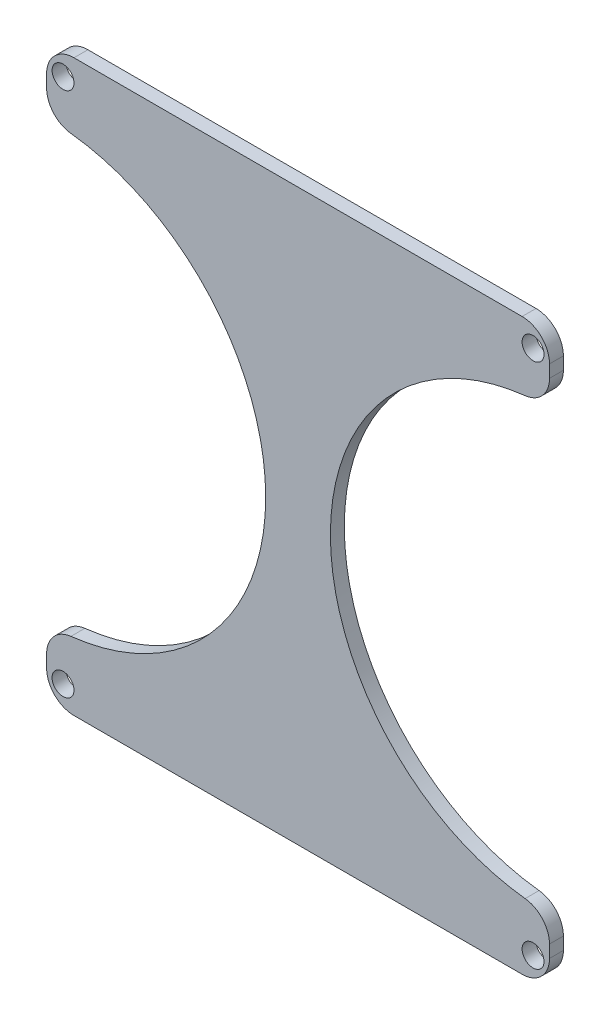
ISO-10303-21;
HEADER;
FILE_DESCRIPTION(('STEP AP214'),'2;1');
FILE_NAME('part.step','',(''),(''),'','','');
FILE_SCHEMA(('AUTOMOTIVE_DESIGN { 1 0 10303 214 1 1 1 1 }'));
ENDSEC;
DATA;
#1=APPLICATION_CONTEXT('core data for automotive mechanical design processes');
#2=APPLICATION_PROTOCOL_DEFINITION('international standard','automotive_design',2000,#1);
#3=PRODUCT_CONTEXT('',#1,'mechanical');
#4=PRODUCT('Part','Part','',(#3));
#5=PRODUCT_RELATED_PRODUCT_CATEGORY('part','',(#4));
#6=PRODUCT_DEFINITION_FORMATION('','',#4);
#7=PRODUCT_DEFINITION_CONTEXT('part definition',#1,'design');
#8=PRODUCT_DEFINITION('design','',#6,#7);
#9=PRODUCT_DEFINITION_SHAPE('','',#8);
#10=(LENGTH_UNIT() NAMED_UNIT(*) SI_UNIT(.MILLI.,.METRE.));
#11=(NAMED_UNIT(*) PLANE_ANGLE_UNIT() SI_UNIT($,.RADIAN.));
#12=(NAMED_UNIT(*) SI_UNIT($,.STERADIAN.) SOLID_ANGLE_UNIT());
#13=UNCERTAINTY_MEASURE_WITH_UNIT(LENGTH_MEASURE(1.E-05),#10,'distance_accuracy_value','');
#14=(GEOMETRIC_REPRESENTATION_CONTEXT(3) GLOBAL_UNCERTAINTY_ASSIGNED_CONTEXT((#13)) GLOBAL_UNIT_ASSIGNED_CONTEXT((#10,
#11,#12)) REPRESENTATION_CONTEXT('',''));
#15=CARTESIAN_POINT('',(0.,0.,0.));
#16=DIRECTION('',(0.,0.,1.));
#17=DIRECTION('',(1.,0.,0.));
#18=AXIS2_PLACEMENT_3D('',#15,#16,#17);
#19=CARTESIAN_POINT('',(-432.763582727884,211.359404221835,2.54));
#20=DIRECTION('',(-1.,0.,0.));
#21=DIRECTION('',(0.,0.,1.));
#22=AXIS2_PLACEMENT_3D('',#19,#20,#21);
#23=PLANE('',#22);
#24=DIRECTION('',(0.,1.,0.));
#25=VECTOR('',#24,1.);
#26=CARTESIAN_POINT('',(-432.763582727884,211.359404221835,2.54));
#27=LINE('',#26,#25);
#28=CARTESIAN_POINT('',(-432.763582727884,308.080763771831,2.54));
#29=VERTEX_POINT('',#28);
#30=CARTESIAN_POINT('',(-432.763582727884,310.359404221835,2.54));
#31=VERTEX_POINT('',#30);
#32=EDGE_CURVE('E175',#29,#31,#27,.T.);
#33=ORIENTED_EDGE('',*,*,#32,.T.);
#34=DIRECTION('',(0.,0.,-1.));
#35=VECTOR('',#34,1.);
#36=CARTESIAN_POINT('',(-432.763582727884,310.359404221835,2.54));
#37=LINE('',#36,#35);
#38=CARTESIAN_POINT('',(-432.763582727884,310.359404221835,0.));
#39=VERTEX_POINT('',#38);
#40=EDGE_CURVE('E223',#31,#39,#37,.T.);
#41=ORIENTED_EDGE('',*,*,#40,.T.);
#42=DIRECTION('',(0.,1.,0.));
#43=VECTOR('',#42,1.);
#44=CARTESIAN_POINT('',(-432.763582727884,211.359404221835,0.));
#45=LINE('',#44,#43);
#46=CARTESIAN_POINT('',(-432.763582727884,308.080763771831,0.));
#47=VERTEX_POINT('',#46);
#48=EDGE_CURVE('E287',#47,#39,#45,.T.);
#49=ORIENTED_EDGE('',*,*,#48,.F.);
#50=DIRECTION('',(0.,0.,1.));
#51=VECTOR('',#50,1.);
#52=CARTESIAN_POINT('',(-432.763582727884,308.080763771831,2.54));
#53=LINE('',#52,#51);
#54=EDGE_CURVE('E221',#47,#29,#53,.T.);
#55=ORIENTED_EDGE('',*,*,#54,.T.);
#56=EDGE_LOOP('',(#33,#41,#49,#55));
#57=FACE_BOUND('',#56,.T.);
#58=ADVANCED_FACE('F37',(#57),#23,.T.);
#59=CARTESIAN_POINT('',(-340.954257897123,211.359404221835,2.54));
#60=DIRECTION('',(-1.,0.,0.));
#61=DIRECTION('',(0.,0.,1.));
#62=AXIS2_PLACEMENT_3D('',#59,#60,#61);
#63=PLANE('',#62);
#64=DIRECTION('',(0.,1.,0.));
#65=VECTOR('',#64,1.);
#66=CARTESIAN_POINT('',(-340.954257897123,211.359404221835,0.));
#67=LINE('',#66,#65);
#68=CARTESIAN_POINT('',(-340.954257897123,308.080763771831,0.));
#69=VERTEX_POINT('',#68);
#70=CARTESIAN_POINT('',(-340.954257897123,310.359404221835,0.));
#71=VERTEX_POINT('',#70);
#72=EDGE_CURVE('E181',#69,#71,#67,.T.);
#73=ORIENTED_EDGE('',*,*,#72,.T.);
#74=DIRECTION('',(0.,0.,-1.));
#75=VECTOR('',#74,1.);
#76=CARTESIAN_POINT('',(-340.954257897123,310.359404221835,2.54));
#77=LINE('',#76,#75);
#78=CARTESIAN_POINT('',(-340.954257897123,310.359404221835,2.54));
#79=VERTEX_POINT('',#78);
#80=EDGE_CURVE('E234',#71,#79,#77,.F.);
#81=ORIENTED_EDGE('',*,*,#80,.T.);
#82=DIRECTION('',(0.,1.,0.));
#83=VECTOR('',#82,1.);
#84=CARTESIAN_POINT('',(-340.954257897123,211.359404221835,2.54));
#85=LINE('',#84,#83);
#86=CARTESIAN_POINT('',(-340.954257897123,308.080763771831,2.54));
#87=VERTEX_POINT('',#86);
#88=EDGE_CURVE('E293',#87,#79,#85,.T.);
#89=ORIENTED_EDGE('',*,*,#88,.F.);
#90=DIRECTION('',(0.,0.,1.));
#91=VECTOR('',#90,1.);
#92=CARTESIAN_POINT('',(-340.954257897123,308.080763771831,0.));
#93=LINE('',#92,#91);
#94=EDGE_CURVE('E231',#87,#69,#93,.F.);
#95=ORIENTED_EDGE('',*,*,#94,.T.);
#96=EDGE_LOOP('',(#73,#81,#89,#95));
#97=FACE_BOUND('',#96,.T.);
#98=ADVANCED_FACE('F342',(#97),#63,.F.);
#99=CARTESIAN_POINT('',(-340.954257897123,216.359404221835,0.));
#100=VERTEX_POINT('',#99);
#101=CARTESIAN_POINT('',(-340.954257897123,218.638044671839,0.));
#102=VERTEX_POINT('',#101);
#103=EDGE_CURVE('E176',#100,#102,#67,.T.);
#104=ORIENTED_EDGE('',*,*,#103,.T.);
#105=DIRECTION('',(0.,0.,1.));
#106=VECTOR('',#105,1.);
#107=CARTESIAN_POINT('',(-340.954257897123,218.638044671839,2.54));
#108=LINE('',#107,#106);
#109=CARTESIAN_POINT('',(-340.954257897123,218.638044671839,2.54));
#110=VERTEX_POINT('',#109);
#111=EDGE_CURVE('E11',#102,#110,#108,.T.);
#112=ORIENTED_EDGE('',*,*,#111,.T.);
#113=CARTESIAN_POINT('',(-340.954257897123,216.359404221835,2.54));
#114=VERTEX_POINT('',#113);
#115=EDGE_CURVE('E243',#114,#110,#85,.T.);
#116=ORIENTED_EDGE('',*,*,#115,.F.);
#117=DIRECTION('',(0.,0.,-1.));
#118=VECTOR('',#117,1.);
#119=CARTESIAN_POINT('',(-340.954257897123,216.359404221835,2.54));
#120=LINE('',#119,#118);
#121=EDGE_CURVE('E45',#114,#100,#120,.T.);
#122=ORIENTED_EDGE('',*,*,#121,.T.);
#123=EDGE_LOOP('',(#104,#112,#116,#122));
#124=FACE_BOUND('',#123,.T.);
#125=ADVANCED_FACE('F242',(#124),#63,.F.);
#126=CARTESIAN_POINT('',(0.,0.,2.54));
#127=DIRECTION('',(0.,0.,-1.));
#128=DIRECTION('',(-1.,0.,0.));
#129=AXIS2_PLACEMENT_3D('',#126,#127,#128);
#130=PLANE('',#129);
#131=CARTESIAN_POINT('',(-343.954257897123,311.359404221835,2.54));
#132=DIRECTION('',(0.,0.,1.));
#133=DIRECTION('',(1.,0.,0.));
#134=AXIS2_PLACEMENT_3D('',#131,#132,#133);
#135=CIRCLE('',#134,2.);
#136=CARTESIAN_POINT('',(-341.954257897123,311.359404221835,2.54));
#137=VERTEX_POINT('',#136);
#138=EDGE_CURVE('E284',#137,#137,#135,.T.);
#139=ORIENTED_EDGE('',*,*,#138,.F.);
#140=EDGE_LOOP('',(#139));
#141=FACE_BOUND('',#140,.T.);
#142=CARTESIAN_POINT('',(-429.763582727884,311.359404221835,2.54));
#143=DIRECTION('',(0.,0.,1.));
#144=DIRECTION('',(1.,0.,0.));
#145=AXIS2_PLACEMENT_3D('',#142,#143,#144);
#146=CIRCLE('',#145,2.);
#147=CARTESIAN_POINT('',(-427.763582727884,311.359404221835,2.54));
#148=VERTEX_POINT('',#147);
#149=EDGE_CURVE('E273',#148,#148,#146,.T.);
#150=ORIENTED_EDGE('',*,*,#149,.F.);
#151=EDGE_LOOP('',(#150));
#152=FACE_BOUND('',#151,.T.);
#153=CARTESIAN_POINT('',(-429.763582727884,215.359404221835,2.54));
#154=DIRECTION('',(0.,0.,1.));
#155=DIRECTION('',(1.,0.,0.));
#156=AXIS2_PLACEMENT_3D('',#153,#154,#155);
#157=CIRCLE('',#156,2.);
#158=CARTESIAN_POINT('',(-427.763582727884,215.359404221835,2.54));
#159=VERTEX_POINT('',#158);
#160=EDGE_CURVE('E279',#159,#159,#157,.T.);
#161=ORIENTED_EDGE('',*,*,#160,.F.);
#162=EDGE_LOOP('',(#161));
#163=FACE_BOUND('',#162,.T.);
#164=CARTESIAN_POINT('',(-343.954257897123,215.359404221835,2.54));
#165=DIRECTION('',(0.,0.,1.));
#166=DIRECTION('',(1.,0.,0.));
#167=AXIS2_PLACEMENT_3D('',#164,#165,#166);
#168=CIRCLE('',#167,2.);
#169=CARTESIAN_POINT('',(-341.954257897123,215.359404221835,2.54));
#170=VERTEX_POINT('',#169);
#171=EDGE_CURVE('E259',#170,#170,#168,.T.);
#172=ORIENTED_EDGE('',*,*,#171,.F.);
#173=EDGE_LOOP('',(#172));
#174=FACE_BOUND('',#173,.T.);
#175=CARTESIAN_POINT('',(-432.763582727884,216.359404221835,2.54));
#176=VERTEX_POINT('',#175);
#177=CARTESIAN_POINT('',(-432.763582727884,218.638044671839,2.54));
#178=VERTEX_POINT('',#177);
#179=EDGE_CURVE('E179',#176,#178,#27,.T.);
#180=ORIENTED_EDGE('',*,*,#179,.F.);
#181=CARTESIAN_POINT('',(-427.763582727884,216.359404221835,2.54));
#182=DIRECTION('',(0.,0.,-1.));
#183=DIRECTION('',(-1.,0.,0.));
#184=AXIS2_PLACEMENT_3D('',#181,#182,#183);
#185=CIRCLE('',#184,5.);
#186=CARTESIAN_POINT('',(-427.763582727884,211.359404221835,2.54));
#187=VERTEX_POINT('',#186);
#188=EDGE_CURVE('E214',#176,#187,#185,.F.);
#189=ORIENTED_EDGE('',*,*,#188,.T.);
#190=DIRECTION('',(1.,0.,0.));
#191=VECTOR('',#190,1.);
#192=CARTESIAN_POINT('',(-432.763582727884,211.359404221835,2.54));
#193=LINE('',#192,#191);
#194=CARTESIAN_POINT('',(-345.954257897123,211.359404221835,2.54));
#195=VERTEX_POINT('',#194);
#196=EDGE_CURVE('E169',#187,#195,#193,.T.);
#197=ORIENTED_EDGE('',*,*,#196,.T.);
#198=CARTESIAN_POINT('',(-345.954257897123,216.359404221835,2.54));
#199=DIRECTION('',(0.,0.,-1.));
#200=DIRECTION('',(-1.,0.,0.));
#201=AXIS2_PLACEMENT_3D('',#198,#199,#200);
#202=CIRCLE('',#201,5.);
#203=EDGE_CURVE('E57',#195,#114,#202,.F.);
#204=ORIENTED_EDGE('',*,*,#203,.T.);
#205=ORIENTED_EDGE('',*,*,#115,.T.);
#206=CARTESIAN_POINT('',(-345.954257897123,218.638044671839,2.54));
#207=DIRECTION('',(0.,0.,-1.));
#208=DIRECTION('',(-1.,0.,0.));
#209=AXIS2_PLACEMENT_3D('',#206,#207,#208);
#210=CIRCLE('',#209,5.);
#211=CARTESIAN_POINT('',(-345.398702341567,223.607084621839,2.54));
#212=VERTEX_POINT('',#211);
#213=EDGE_CURVE('E202',#110,#212,#210,.F.);
#214=ORIENTED_EDGE('',*,*,#213,.T.);
#215=CARTESIAN_POINT('',(-340.954257897123,263.359404221835,2.54));
#216=DIRECTION('',(0.,0.,-1.));
#217=DIRECTION('',(-1.,0.,0.));
#218=AXIS2_PLACEMENT_3D('',#215,#216,#217);
#219=CIRCLE('',#218,40.);
#220=CARTESIAN_POINT('',(-345.398702341567,303.111723821831,2.54));
#221=VERTEX_POINT('',#220);
#222=EDGE_CURVE('E257',#221,#212,#219,.F.);
#223=ORIENTED_EDGE('',*,*,#222,.F.);
#224=CARTESIAN_POINT('',(-345.954257897123,308.080763771831,2.54));
#225=DIRECTION('',(0.,0.,-1.));
#226=DIRECTION('',(-1.,0.,0.));
#227=AXIS2_PLACEMENT_3D('',#224,#225,#226);
#228=CIRCLE('',#227,5.);
#229=EDGE_CURVE('E204',#221,#87,#228,.F.);
#230=ORIENTED_EDGE('',*,*,#229,.T.);
#231=ORIENTED_EDGE('',*,*,#88,.T.);
#232=CARTESIAN_POINT('',(-345.954257897123,310.359404221835,2.54));
#233=DIRECTION('',(0.,0.,-1.));
#234=DIRECTION('',(-1.,0.,0.));
#235=AXIS2_PLACEMENT_3D('',#232,#233,#234);
#236=CIRCLE('',#235,5.);
#237=CARTESIAN_POINT('',(-345.954257897123,315.359404221835,2.54));
#238=VERTEX_POINT('',#237);
#239=EDGE_CURVE('E206',#79,#238,#236,.F.);
#240=ORIENTED_EDGE('',*,*,#239,.T.);
#241=DIRECTION('',(1.,0.,0.));
#242=VECTOR('',#241,1.);
#243=CARTESIAN_POINT('',(-432.763582727884,315.359404221835,2.54));
#244=LINE('',#243,#242);
#245=CARTESIAN_POINT('',(-427.763582727884,315.359404221835,2.54));
#246=VERTEX_POINT('',#245);
#247=EDGE_CURVE('E290',#246,#238,#244,.T.);
#248=ORIENTED_EDGE('',*,*,#247,.F.);
#249=CARTESIAN_POINT('',(-427.763582727884,310.359404221835,2.54));
#250=DIRECTION('',(0.,0.,-1.));
#251=DIRECTION('',(-1.,0.,0.));
#252=AXIS2_PLACEMENT_3D('',#249,#250,#251);
#253=CIRCLE('',#252,5.);
#254=EDGE_CURVE('E210',#246,#31,#253,.F.);
#255=ORIENTED_EDGE('',*,*,#254,.T.);
#256=ORIENTED_EDGE('',*,*,#32,.F.);
#257=CARTESIAN_POINT('',(-427.763582727884,308.080763771831,2.54));
#258=DIRECTION('',(0.,0.,-1.));
#259=DIRECTION('',(-1.,0.,0.));
#260=AXIS2_PLACEMENT_3D('',#257,#258,#259);
#261=CIRCLE('',#260,5.);
#262=CARTESIAN_POINT('',(-428.319138283439,303.111723821831,2.54));
#263=VERTEX_POINT('',#262);
#264=EDGE_CURVE('E208',#29,#263,#261,.F.);
#265=ORIENTED_EDGE('',*,*,#264,.T.);
#266=CARTESIAN_POINT('',(-432.763582727884,263.359404221835,2.54));
#267=DIRECTION('',(0.,0.,-1.));
#268=DIRECTION('',(-1.,0.,0.));
#269=AXIS2_PLACEMENT_3D('',#266,#267,#268);
#270=CIRCLE('',#269,40.);
#271=CARTESIAN_POINT('',(-428.319138283439,223.607084621839,2.54));
#272=VERTEX_POINT('',#271);
#273=EDGE_CURVE('E260',#263,#272,#270,.T.);
#274=ORIENTED_EDGE('',*,*,#273,.T.);
#275=CARTESIAN_POINT('',(-427.763582727884,218.638044671839,2.54));
#276=DIRECTION('',(0.,0.,-1.));
#277=DIRECTION('',(-1.,0.,0.));
#278=AXIS2_PLACEMENT_3D('',#275,#276,#277);
#279=CIRCLE('',#278,5.);
#280=EDGE_CURVE('E212',#272,#178,#279,.F.);
#281=ORIENTED_EDGE('',*,*,#280,.T.);
#282=EDGE_LOOP('',(#180,#189,#197,#204,#205,#214,#223,#230,#231,#240,#248,#255,#256,#265,#274,#281));
#283=FACE_BOUND('',#282,.T.);
#284=ADVANCED_FACE('F318',(#141,#152,#163,#174,#283),#130,.F.);
#285=CARTESIAN_POINT('',(0.,0.,0.));
#286=DIRECTION('',(0.,0.,-1.));
#287=DIRECTION('',(-1.,0.,0.));
#288=AXIS2_PLACEMENT_3D('',#285,#286,#287);
#289=PLANE('',#288);
#290=CARTESIAN_POINT('',(-343.954257897123,215.359404221835,0.));
#291=DIRECTION('',(0.,0.,1.));
#292=DIRECTION('',(1.,0.,0.));
#293=AXIS2_PLACEMENT_3D('',#290,#291,#292);
#294=CIRCLE('',#293,2.);
#295=CARTESIAN_POINT('',(-341.954257897123,215.359404221835,0.));
#296=VERTEX_POINT('',#295);
#297=EDGE_CURVE('E263',#296,#296,#294,.T.);
#298=ORIENTED_EDGE('',*,*,#297,.T.);
#299=EDGE_LOOP('',(#298));
#300=FACE_BOUND('',#299,.T.);
#301=CARTESIAN_POINT('',(-429.763582727884,215.359404221835,0.));
#302=DIRECTION('',(0.,0.,1.));
#303=DIRECTION('',(1.,0.,0.));
#304=AXIS2_PLACEMENT_3D('',#301,#302,#303);
#305=CIRCLE('',#304,2.);
#306=CARTESIAN_POINT('',(-427.763582727884,215.359404221835,0.));
#307=VERTEX_POINT('',#306);
#308=EDGE_CURVE('E276',#307,#307,#305,.T.);
#309=ORIENTED_EDGE('',*,*,#308,.T.);
#310=EDGE_LOOP('',(#309));
#311=FACE_BOUND('',#310,.T.);
#312=CARTESIAN_POINT('',(-429.763582727884,311.359404221835,0.));
#313=DIRECTION('',(0.,0.,1.));
#314=DIRECTION('',(1.,0.,0.));
#315=AXIS2_PLACEMENT_3D('',#312,#313,#314);
#316=CIRCLE('',#315,2.);
#317=CARTESIAN_POINT('',(-427.763582727884,311.359404221835,0.));
#318=VERTEX_POINT('',#317);
#319=EDGE_CURVE('E269',#318,#318,#316,.T.);
#320=ORIENTED_EDGE('',*,*,#319,.T.);
#321=EDGE_LOOP('',(#320));
#322=FACE_BOUND('',#321,.T.);
#323=CARTESIAN_POINT('',(-343.954257897123,311.359404221835,0.));
#324=DIRECTION('',(0.,0.,1.));
#325=DIRECTION('',(1.,0.,0.));
#326=AXIS2_PLACEMENT_3D('',#323,#324,#325);
#327=CIRCLE('',#326,2.);
#328=CARTESIAN_POINT('',(-341.954257897123,311.359404221835,0.));
#329=VERTEX_POINT('',#328);
#330=EDGE_CURVE('E272',#329,#329,#327,.T.);
#331=ORIENTED_EDGE('',*,*,#330,.T.);
#332=EDGE_LOOP('',(#331));
#333=FACE_BOUND('',#332,.T.);
#334=DIRECTION('',(1.,0.,0.));
#335=VECTOR('',#334,1.);
#336=CARTESIAN_POINT('',(-432.763582727884,211.359404221835,0.));
#337=LINE('',#336,#335);
#338=CARTESIAN_POINT('',(-427.763582727884,211.359404221835,0.));
#339=VERTEX_POINT('',#338);
#340=CARTESIAN_POINT('',(-345.954257897123,211.359404221835,0.));
#341=VERTEX_POINT('',#340);
#342=EDGE_CURVE('E167',#339,#341,#337,.T.);
#343=ORIENTED_EDGE('',*,*,#342,.F.);
#344=CARTESIAN_POINT('',(-427.763582727884,216.359404221835,0.));
#345=DIRECTION('',(0.,0.,-1.));
#346=DIRECTION('',(-1.,0.,0.));
#347=AXIS2_PLACEMENT_3D('',#344,#345,#346);
#348=CIRCLE('',#347,5.);
#349=CARTESIAN_POINT('',(-432.763582727884,216.359404221835,0.));
#350=VERTEX_POINT('',#349);
#351=EDGE_CURVE('E150',#339,#350,#348,.T.);
#352=ORIENTED_EDGE('',*,*,#351,.T.);
#353=CARTESIAN_POINT('',(-432.763582727884,218.638044671839,0.));
#354=VERTEX_POINT('',#353);
#355=EDGE_CURVE('E297',#350,#354,#45,.T.);
#356=ORIENTED_EDGE('',*,*,#355,.T.);
#357=CARTESIAN_POINT('',(-427.763582727884,218.638044671839,0.));
#358=DIRECTION('',(0.,0.,-1.));
#359=DIRECTION('',(-1.,0.,0.));
#360=AXIS2_PLACEMENT_3D('',#357,#358,#359);
#361=CIRCLE('',#360,5.);
#362=CARTESIAN_POINT('',(-428.319138283439,223.607084621839,0.));
#363=VERTEX_POINT('',#362);
#364=EDGE_CURVE('E161',#354,#363,#361,.T.);
#365=ORIENTED_EDGE('',*,*,#364,.T.);
#366=CARTESIAN_POINT('',(-432.763582727884,263.359404221835,0.));
#367=DIRECTION('',(0.,0.,-1.));
#368=DIRECTION('',(-1.,0.,0.));
#369=AXIS2_PLACEMENT_3D('',#366,#367,#368);
#370=CIRCLE('',#369,40.);
#371=CARTESIAN_POINT('',(-428.319138283439,303.111723821831,0.));
#372=VERTEX_POINT('',#371);
#373=EDGE_CURVE('E317',#372,#363,#370,.T.);
#374=ORIENTED_EDGE('',*,*,#373,.F.);
#375=CARTESIAN_POINT('',(-427.763582727884,308.080763771831,0.));
#376=DIRECTION('',(0.,0.,-1.));
#377=DIRECTION('',(-1.,0.,0.));
#378=AXIS2_PLACEMENT_3D('',#375,#376,#377);
#379=CIRCLE('',#378,5.);
#380=EDGE_CURVE('E193',#372,#47,#379,.T.);
#381=ORIENTED_EDGE('',*,*,#380,.T.);
#382=ORIENTED_EDGE('',*,*,#48,.T.);
#383=CARTESIAN_POINT('',(-427.763582727884,310.359404221835,0.));
#384=DIRECTION('',(0.,0.,-1.));
#385=DIRECTION('',(-1.,0.,0.));
#386=AXIS2_PLACEMENT_3D('',#383,#384,#385);
#387=CIRCLE('',#386,5.);
#388=CARTESIAN_POINT('',(-427.763582727884,315.359404221835,0.));
#389=VERTEX_POINT('',#388);
#390=EDGE_CURVE('E195',#39,#389,#387,.T.);
#391=ORIENTED_EDGE('',*,*,#390,.T.);
#392=DIRECTION('',(1.,0.,0.));
#393=VECTOR('',#392,1.);
#394=CARTESIAN_POINT('',(-432.763582727884,315.359404221835,0.));
#395=LINE('',#394,#393);
#396=CARTESIAN_POINT('',(-345.954257897123,315.359404221835,0.));
#397=VERTEX_POINT('',#396);
#398=EDGE_CURVE('E298',#389,#397,#395,.T.);
#399=ORIENTED_EDGE('',*,*,#398,.T.);
#400=CARTESIAN_POINT('',(-345.954257897123,310.359404221835,0.));
#401=DIRECTION('',(0.,0.,-1.));
#402=DIRECTION('',(-1.,0.,0.));
#403=AXIS2_PLACEMENT_3D('',#400,#401,#402);
#404=CIRCLE('',#403,5.);
#405=EDGE_CURVE('E191',#397,#71,#404,.T.);
#406=ORIENTED_EDGE('',*,*,#405,.T.);
#407=ORIENTED_EDGE('',*,*,#72,.F.);
#408=CARTESIAN_POINT('',(-345.954257897123,308.080763771831,0.));
#409=DIRECTION('',(0.,0.,-1.));
#410=DIRECTION('',(-1.,0.,0.));
#411=AXIS2_PLACEMENT_3D('',#408,#409,#410);
#412=CIRCLE('',#411,5.);
#413=CARTESIAN_POINT('',(-345.398702341567,303.111723821831,0.));
#414=VERTEX_POINT('',#413);
#415=EDGE_CURVE('E189',#69,#414,#412,.T.);
#416=ORIENTED_EDGE('',*,*,#415,.T.);
#417=CARTESIAN_POINT('',(-340.954257897123,263.359404221835,0.));
#418=DIRECTION('',(0.,0.,-1.));
#419=DIRECTION('',(-1.,0.,0.));
#420=AXIS2_PLACEMENT_3D('',#417,#418,#419);
#421=CIRCLE('',#420,40.);
#422=CARTESIAN_POINT('',(-345.398702341567,223.607084621839,0.));
#423=VERTEX_POINT('',#422);
#424=EDGE_CURVE('E247',#414,#423,#421,.F.);
#425=ORIENTED_EDGE('',*,*,#424,.T.);
#426=CARTESIAN_POINT('',(-345.954257897123,218.638044671839,0.));
#427=DIRECTION('',(0.,0.,-1.));
#428=DIRECTION('',(-1.,0.,0.));
#429=AXIS2_PLACEMENT_3D('',#426,#427,#428);
#430=CIRCLE('',#429,5.);
#431=EDGE_CURVE('E187',#423,#102,#430,.T.);
#432=ORIENTED_EDGE('',*,*,#431,.T.);
#433=ORIENTED_EDGE('',*,*,#103,.F.);
#434=CARTESIAN_POINT('',(-345.954257897123,216.359404221835,0.));
#435=DIRECTION('',(0.,0.,-1.));
#436=DIRECTION('',(-1.,0.,0.));
#437=AXIS2_PLACEMENT_3D('',#434,#435,#436);
#438=CIRCLE('',#437,5.);
#439=EDGE_CURVE('E170',#100,#341,#438,.T.);
#440=ORIENTED_EDGE('',*,*,#439,.T.);
#441=EDGE_LOOP('',(#343,#352,#356,#365,#374,#381,#382,#391,#399,#406,#407,#416,#425,#432,#433,#440));
#442=FACE_BOUND('',#441,.T.);
#443=ADVANCED_FACE('F173',(#300,#311,#322,#333,#442),#289,.T.);
#444=ORIENTED_EDGE('',*,*,#355,.F.);
#445=DIRECTION('',(0.,0.,-1.));
#446=VECTOR('',#445,1.);
#447=CARTESIAN_POINT('',(-432.763582727884,216.359404221835,2.54));
#448=LINE('',#447,#446);
#449=EDGE_CURVE('E155',#350,#176,#448,.F.);
#450=ORIENTED_EDGE('',*,*,#449,.T.);
#451=ORIENTED_EDGE('',*,*,#179,.T.);
#452=DIRECTION('',(0.,0.,1.));
#453=VECTOR('',#452,1.);
#454=CARTESIAN_POINT('',(-432.763582727884,218.638044671839,0.));
#455=LINE('',#454,#453);
#456=EDGE_CURVE('E160',#178,#354,#455,.F.);
#457=ORIENTED_EDGE('',*,*,#456,.T.);
#458=EDGE_LOOP('',(#444,#450,#451,#457));
#459=FACE_BOUND('',#458,.T.);
#460=ADVANCED_FACE('F305',(#459),#23,.T.);
#461=CARTESIAN_POINT('',(-432.763582727884,211.359404221835,2.54));
#462=DIRECTION('',(0.,1.,0.));
#463=DIRECTION('',(0.,0.,1.));
#464=AXIS2_PLACEMENT_3D('',#461,#462,#463);
#465=PLANE('',#464);
#466=ORIENTED_EDGE('',*,*,#196,.F.);
#467=DIRECTION('',(0.,0.,-1.));
#468=VECTOR('',#467,1.);
#469=CARTESIAN_POINT('',(-427.763582727884,211.359404221835,0.));
#470=LINE('',#469,#468);
#471=EDGE_CURVE('E154',#187,#339,#470,.T.);
#472=ORIENTED_EDGE('',*,*,#471,.T.);
#473=ORIENTED_EDGE('',*,*,#342,.T.);
#474=DIRECTION('',(0.,0.,-1.));
#475=VECTOR('',#474,1.);
#476=CARTESIAN_POINT('',(-345.954257897123,211.359404221835,2.54));
#477=LINE('',#476,#475);
#478=EDGE_CURVE('E171',#341,#195,#477,.F.);
#479=ORIENTED_EDGE('',*,*,#478,.T.);
#480=EDGE_LOOP('',(#466,#472,#473,#479));
#481=FACE_BOUND('',#480,.T.);
#482=ADVANCED_FACE('F166',(#481),#465,.F.);
#483=CARTESIAN_POINT('',(-432.763582727884,315.359404221835,2.54));
#484=DIRECTION('',(0.,1.,0.));
#485=DIRECTION('',(0.,0.,1.));
#486=AXIS2_PLACEMENT_3D('',#483,#484,#485);
#487=PLANE('',#486);
#488=ORIENTED_EDGE('',*,*,#398,.F.);
#489=DIRECTION('',(0.,0.,-1.));
#490=VECTOR('',#489,1.);
#491=CARTESIAN_POINT('',(-427.763582727884,315.359404221835,2.54));
#492=LINE('',#491,#490);
#493=EDGE_CURVE('E229',#389,#246,#492,.F.);
#494=ORIENTED_EDGE('',*,*,#493,.T.);
#495=ORIENTED_EDGE('',*,*,#247,.T.);
#496=DIRECTION('',(0.,0.,-1.));
#497=VECTOR('',#496,1.);
#498=CARTESIAN_POINT('',(-345.954257897123,315.359404221835,0.));
#499=LINE('',#498,#497);
#500=EDGE_CURVE('E226',#238,#397,#499,.T.);
#501=ORIENTED_EDGE('',*,*,#500,.T.);
#502=EDGE_LOOP('',(#488,#494,#495,#501));
#503=FACE_BOUND('',#502,.T.);
#504=ADVANCED_FACE('F333',(#503),#487,.T.);
#505=CARTESIAN_POINT('',(-343.954257897123,311.359404221835,2.54));
#506=DIRECTION('',(0.,0.,-1.));
#507=DIRECTION('',(-1.,0.,0.));
#508=AXIS2_PLACEMENT_3D('',#505,#506,#507);
#509=CYLINDRICAL_SURFACE('',#508,2.);
#510=ORIENTED_EDGE('',*,*,#138,.T.);
#511=EDGE_LOOP('',(#510));
#512=FACE_BOUND('',#511,.T.);
#513=ORIENTED_EDGE('',*,*,#330,.F.);
#514=EDGE_LOOP('',(#513));
#515=FACE_BOUND('',#514,.T.);
#516=ADVANCED_FACE('F379',(#512,#515),#509,.F.);
#517=CARTESIAN_POINT('',(-429.763582727884,311.359404221835,2.54));
#518=DIRECTION('',(0.,0.,-1.));
#519=DIRECTION('',(-1.,0.,0.));
#520=AXIS2_PLACEMENT_3D('',#517,#518,#519);
#521=CYLINDRICAL_SURFACE('',#520,2.);
#522=ORIENTED_EDGE('',*,*,#149,.T.);
#523=EDGE_LOOP('',(#522));
#524=FACE_BOUND('',#523,.T.);
#525=ORIENTED_EDGE('',*,*,#319,.F.);
#526=EDGE_LOOP('',(#525));
#527=FACE_BOUND('',#526,.T.);
#528=ADVANCED_FACE('F383',(#524,#527),#521,.F.);
#529=CARTESIAN_POINT('',(-429.763582727884,215.359404221835,2.54));
#530=DIRECTION('',(0.,0.,-1.));
#531=DIRECTION('',(-1.,0.,0.));
#532=AXIS2_PLACEMENT_3D('',#529,#530,#531);
#533=CYLINDRICAL_SURFACE('',#532,2.);
#534=ORIENTED_EDGE('',*,*,#160,.T.);
#535=EDGE_LOOP('',(#534));
#536=FACE_BOUND('',#535,.T.);
#537=ORIENTED_EDGE('',*,*,#308,.F.);
#538=EDGE_LOOP('',(#537));
#539=FACE_BOUND('',#538,.T.);
#540=ADVANCED_FACE('F388',(#536,#539),#533,.F.);
#541=CARTESIAN_POINT('',(-343.954257897123,215.359404221835,2.54));
#542=DIRECTION('',(0.,0.,-1.));
#543=DIRECTION('',(-1.,0.,0.));
#544=AXIS2_PLACEMENT_3D('',#541,#542,#543);
#545=CYLINDRICAL_SURFACE('',#544,2.);
#546=ORIENTED_EDGE('',*,*,#171,.T.);
#547=EDGE_LOOP('',(#546));
#548=FACE_BOUND('',#547,.T.);
#549=ORIENTED_EDGE('',*,*,#297,.F.);
#550=EDGE_LOOP('',(#549));
#551=FACE_BOUND('',#550,.T.);
#552=ADVANCED_FACE('F393',(#548,#551),#545,.F.);
#553=CARTESIAN_POINT('',(-432.763582727884,263.359404221835,10.));
#554=DIRECTION('',(0.,0.,-1.));
#555=DIRECTION('',(-1.,0.,0.));
#556=AXIS2_PLACEMENT_3D('',#553,#554,#555);
#557=CYLINDRICAL_SURFACE('',#556,40.);
#558=ORIENTED_EDGE('',*,*,#373,.T.);
#559=DIRECTION('',(0.,0.,-1.));
#560=VECTOR('',#559,1.);
#561=CARTESIAN_POINT('',(-428.319138283439,223.607084621839,10.));
#562=LINE('',#561,#560);
#563=EDGE_CURVE('E219',#363,#272,#562,.F.);
#564=ORIENTED_EDGE('',*,*,#563,.T.);
#565=ORIENTED_EDGE('',*,*,#273,.F.);
#566=DIRECTION('',(0.,0.,-1.));
#567=VECTOR('',#566,1.);
#568=CARTESIAN_POINT('',(-428.319138283439,303.111723821831,10.));
#569=LINE('',#568,#567);
#570=EDGE_CURVE('E216',#263,#372,#569,.T.);
#571=ORIENTED_EDGE('',*,*,#570,.T.);
#572=EDGE_LOOP('',(#558,#564,#565,#571));
#573=FACE_BOUND('',#572,.T.);
#574=ADVANCED_FACE('F315',(#573),#557,.F.);
#575=CARTESIAN_POINT('',(-340.954257897123,263.359404221835,10.));
#576=DIRECTION('',(0.,0.,-1.));
#577=DIRECTION('',(-1.,0.,0.));
#578=AXIS2_PLACEMENT_3D('',#575,#576,#577);
#579=CYLINDRICAL_SURFACE('',#578,40.);
#580=ORIENTED_EDGE('',*,*,#424,.F.);
#581=DIRECTION('',(0.,0.,-1.));
#582=VECTOR('',#581,1.);
#583=CARTESIAN_POINT('',(-345.398702341567,303.111723821831,10.));
#584=LINE('',#583,#582);
#585=EDGE_CURVE('E239',#414,#221,#584,.F.);
#586=ORIENTED_EDGE('',*,*,#585,.T.);
#587=ORIENTED_EDGE('',*,*,#222,.T.);
#588=DIRECTION('',(0.,0.,-1.));
#589=VECTOR('',#588,1.);
#590=CARTESIAN_POINT('',(-345.398702341567,223.607084621839,10.));
#591=LINE('',#590,#589);
#592=EDGE_CURVE('E236',#212,#423,#591,.T.);
#593=ORIENTED_EDGE('',*,*,#592,.T.);
#594=EDGE_LOOP('',(#580,#586,#587,#593));
#595=FACE_BOUND('',#594,.T.);
#596=ADVANCED_FACE('F254',(#595),#579,.F.);
#597=CARTESIAN_POINT('',(-427.763582727884,216.359404221835,2.54));
#598=DIRECTION('',(0.,0.,1.));
#599=DIRECTION('',(1.,0.,0.));
#600=AXIS2_PLACEMENT_3D('',#597,#598,#599);
#601=CYLINDRICAL_SURFACE('',#600,5.);
#602=ORIENTED_EDGE('',*,*,#188,.F.);
#603=ORIENTED_EDGE('',*,*,#449,.F.);
#604=ORIENTED_EDGE('',*,*,#351,.F.);
#605=ORIENTED_EDGE('',*,*,#471,.F.);
#606=EDGE_LOOP('',(#602,#603,#604,#605));
#607=FACE_BOUND('',#606,.T.);
#608=ADVANCED_FACE('F153',(#607),#601,.T.);
#609=CARTESIAN_POINT('',(-427.763582727884,218.638044671839,10.));
#610=DIRECTION('',(0.,0.,-1.));
#611=DIRECTION('',(-1.,0.,0.));
#612=AXIS2_PLACEMENT_3D('',#609,#610,#611);
#613=CYLINDRICAL_SURFACE('',#612,5.);
#614=ORIENTED_EDGE('',*,*,#280,.F.);
#615=ORIENTED_EDGE('',*,*,#563,.F.);
#616=ORIENTED_EDGE('',*,*,#364,.F.);
#617=ORIENTED_EDGE('',*,*,#456,.F.);
#618=EDGE_LOOP('',(#614,#615,#616,#617));
#619=FACE_BOUND('',#618,.T.);
#620=ADVANCED_FACE('F311',(#619),#613,.T.);
#621=CARTESIAN_POINT('',(-427.763582727884,310.359404221835,2.54));
#622=DIRECTION('',(0.,0.,-1.));
#623=DIRECTION('',(-1.,0.,0.));
#624=AXIS2_PLACEMENT_3D('',#621,#622,#623);
#625=CYLINDRICAL_SURFACE('',#624,5.);
#626=ORIENTED_EDGE('',*,*,#254,.F.);
#627=ORIENTED_EDGE('',*,*,#493,.F.);
#628=ORIENTED_EDGE('',*,*,#390,.F.);
#629=ORIENTED_EDGE('',*,*,#40,.F.);
#630=EDGE_LOOP('',(#626,#627,#628,#629));
#631=FACE_BOUND('',#630,.T.);
#632=ADVANCED_FACE('F330',(#631),#625,.T.);
#633=CARTESIAN_POINT('',(-427.763582727884,308.080763771831,10.));
#634=DIRECTION('',(0.,0.,-1.));
#635=DIRECTION('',(-1.,0.,0.));
#636=AXIS2_PLACEMENT_3D('',#633,#634,#635);
#637=CYLINDRICAL_SURFACE('',#636,5.);
#638=ORIENTED_EDGE('',*,*,#264,.F.);
#639=ORIENTED_EDGE('',*,*,#54,.F.);
#640=ORIENTED_EDGE('',*,*,#380,.F.);
#641=ORIENTED_EDGE('',*,*,#570,.F.);
#642=EDGE_LOOP('',(#638,#639,#640,#641));
#643=FACE_BOUND('',#642,.T.);
#644=ADVANCED_FACE('F323',(#643),#637,.T.);
#645=CARTESIAN_POINT('',(-345.954257897123,310.359404221835,2.54));
#646=DIRECTION('',(0.,0.,1.));
#647=DIRECTION('',(1.,0.,0.));
#648=AXIS2_PLACEMENT_3D('',#645,#646,#647);
#649=CYLINDRICAL_SURFACE('',#648,5.);
#650=ORIENTED_EDGE('',*,*,#239,.F.);
#651=ORIENTED_EDGE('',*,*,#80,.F.);
#652=ORIENTED_EDGE('',*,*,#405,.F.);
#653=ORIENTED_EDGE('',*,*,#500,.F.);
#654=EDGE_LOOP('',(#650,#651,#652,#653));
#655=FACE_BOUND('',#654,.T.);
#656=ADVANCED_FACE('F338',(#655),#649,.T.);
#657=CARTESIAN_POINT('',(-345.954257897123,308.080763771831,10.));
#658=DIRECTION('',(0.,0.,-1.));
#659=DIRECTION('',(-1.,0.,0.));
#660=AXIS2_PLACEMENT_3D('',#657,#658,#659);
#661=CYLINDRICAL_SURFACE('',#660,5.);
#662=ORIENTED_EDGE('',*,*,#229,.F.);
#663=ORIENTED_EDGE('',*,*,#585,.F.);
#664=ORIENTED_EDGE('',*,*,#415,.F.);
#665=ORIENTED_EDGE('',*,*,#94,.F.);
#666=EDGE_LOOP('',(#662,#663,#664,#665));
#667=FACE_BOUND('',#666,.T.);
#668=ADVANCED_FACE('F347',(#667),#661,.T.);
#669=CARTESIAN_POINT('',(-345.954257897123,218.638044671839,10.));
#670=DIRECTION('',(0.,0.,-1.));
#671=DIRECTION('',(-1.,0.,0.));
#672=AXIS2_PLACEMENT_3D('',#669,#670,#671);
#673=CYLINDRICAL_SURFACE('',#672,5.);
#674=ORIENTED_EDGE('',*,*,#213,.F.);
#675=ORIENTED_EDGE('',*,*,#111,.F.);
#676=ORIENTED_EDGE('',*,*,#431,.F.);
#677=ORIENTED_EDGE('',*,*,#592,.F.);
#678=EDGE_LOOP('',(#674,#675,#676,#677));
#679=FACE_BOUND('',#678,.T.);
#680=ADVANCED_FACE('F251',(#679),#673,.T.);
#681=CARTESIAN_POINT('',(-345.954257897123,216.359404221835,2.54));
#682=DIRECTION('',(0.,0.,-1.));
#683=DIRECTION('',(-1.,0.,0.));
#684=AXIS2_PLACEMENT_3D('',#681,#682,#683);
#685=CYLINDRICAL_SURFACE('',#684,5.);
#686=ORIENTED_EDGE('',*,*,#203,.F.);
#687=ORIENTED_EDGE('',*,*,#478,.F.);
#688=ORIENTED_EDGE('',*,*,#439,.F.);
#689=ORIENTED_EDGE('',*,*,#121,.F.);
#690=EDGE_LOOP('',(#686,#687,#688,#689));
#691=FACE_BOUND('',#690,.T.);
#692=ADVANCED_FACE('F39',(#691),#685,.T.);
#693=CLOSED_SHELL('',(#58,#98,#125,#284,#443,#460,#482,#504,#516,#528,#540,#552,#574,#596,#608,
#620,#632,#644,#656,#668,#680,#692));
#694=MANIFOLD_SOLID_BREP('B2',#693);
#695=ADVANCED_BREP_SHAPE_REPRESENTATION('',(#18,#694),#14);
#696=SHAPE_DEFINITION_REPRESENTATION(#9,#695);
ENDSEC;
END-ISO-10303-21;
